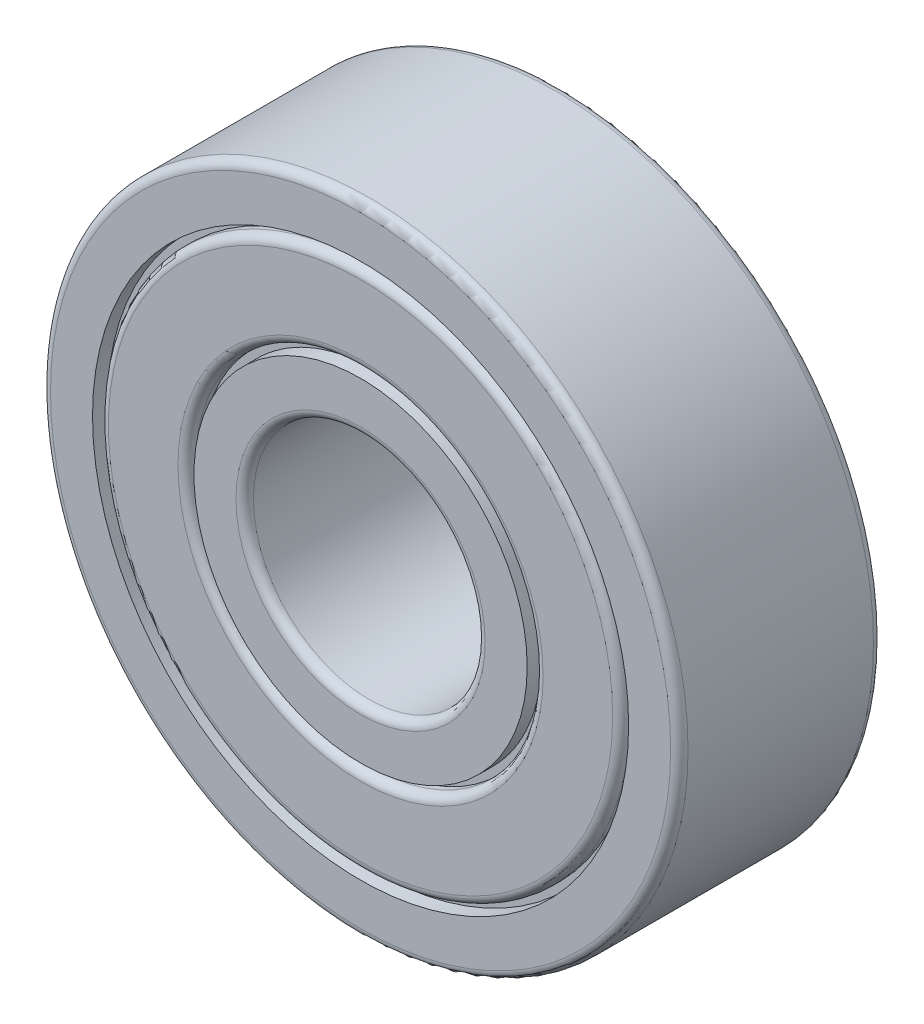
ISO-10303-21;
HEADER;
FILE_DESCRIPTION(('STEP AP214'),'2;1');
FILE_NAME('part.step','',(''),(''),'','','');
FILE_SCHEMA(('AUTOMOTIVE_DESIGN { 1 0 10303 214 1 1 1 1 }'));
ENDSEC;
DATA;
#1=APPLICATION_CONTEXT('core data for automotive mechanical design processes');
#2=APPLICATION_PROTOCOL_DEFINITION('international standard','automotive_design',2000,#1);
#3=PRODUCT_CONTEXT('',#1,'mechanical');
#4=PRODUCT('Part','Part','',(#3));
#5=PRODUCT_RELATED_PRODUCT_CATEGORY('part','',(#4));
#6=PRODUCT_DEFINITION_FORMATION('','',#4);
#7=PRODUCT_DEFINITION_CONTEXT('part definition',#1,'design');
#8=PRODUCT_DEFINITION('design','',#6,#7);
#9=PRODUCT_DEFINITION_SHAPE('','',#8);
#10=(LENGTH_UNIT() NAMED_UNIT(*) SI_UNIT(.MILLI.,.METRE.));
#11=(NAMED_UNIT(*) PLANE_ANGLE_UNIT() SI_UNIT($,.RADIAN.));
#12=(NAMED_UNIT(*) SI_UNIT($,.STERADIAN.) SOLID_ANGLE_UNIT());
#13=UNCERTAINTY_MEASURE_WITH_UNIT(LENGTH_MEASURE(1.E-05),#10,'distance_accuracy_value','');
#14=(GEOMETRIC_REPRESENTATION_CONTEXT(3) GLOBAL_UNCERTAINTY_ASSIGNED_CONTEXT((#13)) GLOBAL_UNIT_ASSIGNED_CONTEXT((#10,
#11,#12)) REPRESENTATION_CONTEXT('',''));
#15=CARTESIAN_POINT('',(0.,0.,0.));
#16=DIRECTION('',(0.,0.,1.));
#17=DIRECTION('',(1.,0.,0.));
#18=AXIS2_PLACEMENT_3D('',#15,#16,#17);
#19=CARTESIAN_POINT('',(0.,0.,-25.4558441227157));
#20=DIRECTION('',(0.,0.,1.));
#21=DIRECTION('',(1.,0.,0.));
#22=AXIS2_PLACEMENT_3D('',#19,#20,#21);
#23=CYLINDRICAL_SURFACE('',#22,6.);
#24=CARTESIAN_POINT('',(0.,0.,0.5));
#25=DIRECTION('',(0.,0.,-1.));
#26=DIRECTION('',(-1.,0.,0.));
#27=AXIS2_PLACEMENT_3D('',#24,#25,#26);
#28=CIRCLE('',#27,6.);
#29=CARTESIAN_POINT('',(-6.,0.,0.5));
#30=VERTEX_POINT('',#29);
#31=EDGE_CURVE('E90',#30,#30,#28,.T.);
#32=ORIENTED_EDGE('',*,*,#31,.F.);
#33=EDGE_LOOP('',(#32));
#34=FACE_BOUND('',#33,.T.);
#35=CARTESIAN_POINT('',(0.,0.,0.));
#36=DIRECTION('',(0.,0.,1.));
#37=DIRECTION('',(1.,0.,0.));
#38=AXIS2_PLACEMENT_3D('',#35,#36,#37);
#39=CIRCLE('',#38,6.);
#40=CARTESIAN_POINT('',(6.,0.,0.));
#41=VERTEX_POINT('',#40);
#42=EDGE_CURVE('E70',#41,#41,#39,.F.);
#43=ORIENTED_EDGE('',*,*,#42,.T.);
#44=EDGE_LOOP('',(#43));
#45=FACE_BOUND('',#44,.T.);
#46=ADVANCED_FACE('F43',(#34,#45),#23,.F.);
#47=CARTESIAN_POINT('',(0.,0.,-25.4558441227157));
#48=DIRECTION('',(0.,0.,1.));
#49=DIRECTION('',(1.,0.,0.));
#50=AXIS2_PLACEMENT_3D('',#47,#48,#49);
#51=CYLINDRICAL_SURFACE('',#50,9.);
#52=CARTESIAN_POINT('',(0.,0.,0.5));
#53=DIRECTION('',(0.,0.,-1.));
#54=DIRECTION('',(-1.,0.,0.));
#55=AXIS2_PLACEMENT_3D('',#52,#53,#54);
#56=CIRCLE('',#55,9.);
#57=CARTESIAN_POINT('',(-9.,0.,0.5));
#58=VERTEX_POINT('',#57);
#59=EDGE_CURVE('E11',#58,#58,#56,.F.);
#60=ORIENTED_EDGE('',*,*,#59,.F.);
#61=EDGE_LOOP('',(#60));
#62=FACE_BOUND('',#61,.T.);
#63=CARTESIAN_POINT('',(0.,0.,0.));
#64=DIRECTION('',(0.,0.,1.));
#65=DIRECTION('',(1.,0.,0.));
#66=AXIS2_PLACEMENT_3D('',#63,#64,#65);
#67=CIRCLE('',#66,9.);
#68=CARTESIAN_POINT('',(9.,0.,0.));
#69=VERTEX_POINT('',#68);
#70=EDGE_CURVE('E69',#69,#69,#67,.F.);
#71=ORIENTED_EDGE('',*,*,#70,.F.);
#72=EDGE_LOOP('',(#71));
#73=FACE_BOUND('',#72,.T.);
#74=ADVANCED_FACE('F99',(#62,#73),#51,.T.);
#75=CARTESIAN_POINT('',(0.,0.,6.5));
#76=DIRECTION('',(0.,0.,1.));
#77=DIRECTION('',(1.,0.,0.));
#78=AXIS2_PLACEMENT_3D('',#75,#76,#77);
#79=CIRCLE('',#78,9.);
#80=CARTESIAN_POINT('',(9.,0.,6.5));
#81=VERTEX_POINT('',#80);
#82=EDGE_CURVE('E50',#81,#81,#79,.F.);
#83=ORIENTED_EDGE('',*,*,#82,.F.);
#84=EDGE_LOOP('',(#83));
#85=FACE_BOUND('',#84,.T.);
#86=CARTESIAN_POINT('',(0.,0.,6.7));
#87=DIRECTION('',(0.,0.,1.));
#88=DIRECTION('',(1.,0.,0.));
#89=AXIS2_PLACEMENT_3D('',#86,#87,#88);
#90=CIRCLE('',#89,9.);
#91=CARTESIAN_POINT('',(9.,0.,6.7));
#92=VERTEX_POINT('',#91);
#93=EDGE_CURVE('E54',#92,#92,#90,.F.);
#94=ORIENTED_EDGE('',*,*,#93,.T.);
#95=EDGE_LOOP('',(#94));
#96=FACE_BOUND('',#95,.T.);
#97=ADVANCED_FACE('F122',(#85,#96),#51,.T.);
#98=CARTESIAN_POINT('',(0.,0.,7.));
#99=DIRECTION('',(0.,0.,1.));
#100=DIRECTION('',(1.,0.,0.));
#101=AXIS2_PLACEMENT_3D('',#98,#99,#100);
#102=PLANE('',#101);
#103=CARTESIAN_POINT('',(0.,0.,7.));
#104=DIRECTION('',(0.,0.,1.));
#105=DIRECTION('',(1.,0.,0.));
#106=AXIS2_PLACEMENT_3D('',#103,#104,#105);
#107=CIRCLE('',#106,6.3);
#108=CARTESIAN_POINT('',(6.3,0.,7.));
#109=VERTEX_POINT('',#108);
#110=EDGE_CURVE('E58',#109,#109,#107,.F.);
#111=ORIENTED_EDGE('',*,*,#110,.T.);
#112=EDGE_LOOP('',(#111));
#113=FACE_BOUND('',#112,.T.);
#114=CARTESIAN_POINT('',(0.,0.,7.));
#115=DIRECTION('',(0.,0.,1.));
#116=DIRECTION('',(1.,0.,0.));
#117=AXIS2_PLACEMENT_3D('',#114,#115,#116);
#118=CIRCLE('',#117,8.7);
#119=CARTESIAN_POINT('',(8.7,0.,7.));
#120=VERTEX_POINT('',#119);
#121=EDGE_CURVE('E63',#120,#120,#118,.T.);
#122=ORIENTED_EDGE('',*,*,#121,.T.);
#123=EDGE_LOOP('',(#122));
#124=FACE_BOUND('',#123,.T.);
#125=ADVANCED_FACE('F114',(#113,#124),#102,.T.);
#126=CARTESIAN_POINT('',(0.,0.,6.5));
#127=DIRECTION('',(0.,0.,-1.));
#128=DIRECTION('',(-1.,0.,0.));
#129=AXIS2_PLACEMENT_3D('',#126,#127,#128);
#130=CIRCLE('',#129,6.);
#131=CARTESIAN_POINT('',(-6.,0.,6.5));
#132=VERTEX_POINT('',#131);
#133=EDGE_CURVE('E87',#132,#132,#130,.T.);
#134=ORIENTED_EDGE('',*,*,#133,.T.);
#135=EDGE_LOOP('',(#134));
#136=FACE_BOUND('',#135,.T.);
#137=CARTESIAN_POINT('',(0.,0.,6.7));
#138=DIRECTION('',(0.,0.,1.));
#139=DIRECTION('',(1.,0.,0.));
#140=AXIS2_PLACEMENT_3D('',#137,#138,#139);
#141=CIRCLE('',#140,6.);
#142=CARTESIAN_POINT('',(6.,0.,6.7));
#143=VERTEX_POINT('',#142);
#144=EDGE_CURVE('E66',#143,#143,#141,.T.);
#145=ORIENTED_EDGE('',*,*,#144,.T.);
#146=EDGE_LOOP('',(#145));
#147=FACE_BOUND('',#146,.T.);
#148=ADVANCED_FACE('F101',(#136,#147),#23,.F.);
#149=CARTESIAN_POINT('',(0.,0.,0.));
#150=DIRECTION('',(0.,0.,1.));
#151=DIRECTION('',(1.,0.,0.));
#152=AXIS2_PLACEMENT_3D('',#149,#150,#151);
#153=PLANE('',#152);
#154=ORIENTED_EDGE('',*,*,#70,.T.);
#155=EDGE_LOOP('',(#154));
#156=FACE_BOUND('',#155,.T.);
#157=ORIENTED_EDGE('',*,*,#42,.F.);
#158=EDGE_LOOP('',(#157));
#159=FACE_BOUND('',#158,.T.);
#160=ADVANCED_FACE('F104',(#156,#159),#153,.F.);
#161=CARTESIAN_POINT('',(0.,0.,6.7));
#162=DIRECTION('',(0.,0.,1.));
#163=DIRECTION('',(1.,0.,0.));
#164=AXIS2_PLACEMENT_3D('',#161,#162,#163);
#165=TOROIDAL_SURFACE('',#164,6.3,0.3);
#166=ORIENTED_EDGE('',*,*,#110,.F.);
#167=EDGE_LOOP('',(#166));
#168=FACE_BOUND('',#167,.T.);
#169=ORIENTED_EDGE('',*,*,#144,.F.);
#170=EDGE_LOOP('',(#169));
#171=FACE_BOUND('',#170,.T.);
#172=ADVANCED_FACE('F106',(#168,#171),#165,.T.);
#173=CARTESIAN_POINT('',(0.,0.,6.7));
#174=DIRECTION('',(0.,0.,1.));
#175=DIRECTION('',(1.,0.,0.));
#176=AXIS2_PLACEMENT_3D('',#173,#174,#175);
#177=TOROIDAL_SURFACE('',#176,8.7,0.3);
#178=ORIENTED_EDGE('',*,*,#93,.F.);
#179=EDGE_LOOP('',(#178));
#180=FACE_BOUND('',#179,.T.);
#181=ORIENTED_EDGE('',*,*,#121,.F.);
#182=EDGE_LOOP('',(#181));
#183=FACE_BOUND('',#182,.T.);
#184=ADVANCED_FACE('F45',(#180,#183),#177,.T.);
#185=CARTESIAN_POINT('',(0.,9.25,0.5));
#186=DIRECTION('',(0.,0.,-1.));
#187=DIRECTION('',(-1.,0.,0.));
#188=AXIS2_PLACEMENT_3D('',#185,#186,#187);
#189=PLANE('',#188);
#190=CARTESIAN_POINT('',(0.,0.,0.5));
#191=DIRECTION('',(0.,0.,-1.));
#192=DIRECTION('',(-1.,0.,0.));
#193=AXIS2_PLACEMENT_3D('',#190,#191,#192);
#194=CIRCLE('',#193,9.25);
#195=CARTESIAN_POINT('',(-9.25,0.,0.5));
#196=VERTEX_POINT('',#195);
#197=EDGE_CURVE('E78',#196,#196,#194,.T.);
#198=ORIENTED_EDGE('',*,*,#197,.T.);
#199=EDGE_LOOP('',(#198));
#200=FACE_BOUND('',#199,.T.);
#201=ORIENTED_EDGE('',*,*,#59,.T.);
#202=EDGE_LOOP('',(#201));
#203=FACE_BOUND('',#202,.T.);
#204=ADVANCED_FACE('F117',(#200,#203),#189,.T.);
#205=CARTESIAN_POINT('',(0.,9.25,6.5));
#206=DIRECTION('',(0.,0.,1.));
#207=DIRECTION('',(1.,0.,0.));
#208=AXIS2_PLACEMENT_3D('',#205,#206,#207);
#209=PLANE('',#208);
#210=ORIENTED_EDGE('',*,*,#82,.T.);
#211=EDGE_LOOP('',(#210));
#212=FACE_BOUND('',#211,.T.);
#213=CARTESIAN_POINT('',(0.,0.,6.5));
#214=DIRECTION('',(0.,0.,-1.));
#215=DIRECTION('',(-1.,0.,0.));
#216=AXIS2_PLACEMENT_3D('',#213,#214,#215);
#217=CIRCLE('',#216,9.25);
#218=CARTESIAN_POINT('',(-9.25,0.,6.5));
#219=VERTEX_POINT('',#218);
#220=EDGE_CURVE('E73',#219,#219,#217,.T.);
#221=ORIENTED_EDGE('',*,*,#220,.F.);
#222=EDGE_LOOP('',(#221));
#223=FACE_BOUND('',#222,.T.);
#224=ADVANCED_FACE('F140',(#212,#223),#209,.T.);
#225=CARTESIAN_POINT('',(0.,0.,-0.35));
#226=DIRECTION('',(0.,0.,-1.));
#227=DIRECTION('',(-1.,0.,0.));
#228=AXIS2_PLACEMENT_3D('',#225,#226,#227);
#229=CYLINDRICAL_SURFACE('',#228,9.25);
#230=ORIENTED_EDGE('',*,*,#220,.T.);
#231=EDGE_LOOP('',(#230));
#232=FACE_BOUND('',#231,.T.);
#233=ORIENTED_EDGE('',*,*,#197,.F.);
#234=EDGE_LOOP('',(#233));
#235=FACE_BOUND('',#234,.T.);
#236=ADVANCED_FACE('F145',(#232,#235),#229,.T.);
#237=CARTESIAN_POINT('',(0.,6.,0.5));
#238=DIRECTION('',(0.,0.,-1.));
#239=DIRECTION('',(-1.,0.,0.));
#240=AXIS2_PLACEMENT_3D('',#237,#238,#239);
#241=PLANE('',#240);
#242=ORIENTED_EDGE('',*,*,#31,.T.);
#243=EDGE_LOOP('',(#242));
#244=FACE_BOUND('',#243,.T.);
#245=CARTESIAN_POINT('',(0.,0.,0.5));
#246=DIRECTION('',(0.,0.,-1.));
#247=DIRECTION('',(-1.,0.,0.));
#248=AXIS2_PLACEMENT_3D('',#245,#246,#247);
#249=CIRCLE('',#248,5.75);
#250=CARTESIAN_POINT('',(-5.75,0.,0.5));
#251=VERTEX_POINT('',#250);
#252=EDGE_CURVE('E81',#251,#251,#249,.T.);
#253=ORIENTED_EDGE('',*,*,#252,.F.);
#254=EDGE_LOOP('',(#253));
#255=FACE_BOUND('',#254,.T.);
#256=ADVANCED_FACE('F94',(#244,#255),#241,.T.);
#257=CARTESIAN_POINT('',(0.,0.,-0.35));
#258=DIRECTION('',(0.,0.,-1.));
#259=DIRECTION('',(-1.,0.,0.));
#260=AXIS2_PLACEMENT_3D('',#257,#258,#259);
#261=CYLINDRICAL_SURFACE('',#260,5.75);
#262=ORIENTED_EDGE('',*,*,#252,.T.);
#263=EDGE_LOOP('',(#262));
#264=FACE_BOUND('',#263,.T.);
#265=CARTESIAN_POINT('',(0.,0.,6.5));
#266=DIRECTION('',(0.,0.,-1.));
#267=DIRECTION('',(-1.,0.,0.));
#268=AXIS2_PLACEMENT_3D('',#265,#266,#267);
#269=CIRCLE('',#268,5.75);
#270=CARTESIAN_POINT('',(-5.75,0.,6.5));
#271=VERTEX_POINT('',#270);
#272=EDGE_CURVE('E84',#271,#271,#269,.T.);
#273=ORIENTED_EDGE('',*,*,#272,.F.);
#274=EDGE_LOOP('',(#273));
#275=FACE_BOUND('',#274,.T.);
#276=ADVANCED_FACE('F154',(#264,#275),#261,.F.);
#277=CARTESIAN_POINT('',(0.,6.,6.5));
#278=DIRECTION('',(0.,0.,1.));
#279=DIRECTION('',(1.,0.,0.));
#280=AXIS2_PLACEMENT_3D('',#277,#278,#279);
#281=PLANE('',#280);
#282=ORIENTED_EDGE('',*,*,#272,.T.);
#283=EDGE_LOOP('',(#282));
#284=FACE_BOUND('',#283,.T.);
#285=ORIENTED_EDGE('',*,*,#133,.F.);
#286=EDGE_LOOP('',(#285));
#287=FACE_BOUND('',#286,.T.);
#288=ADVANCED_FACE('F159',(#284,#287),#281,.T.);
#289=CLOSED_SHELL('',(#46,#74,#97,#125,#148,#160,#172,#184,#204,#224,#236,#256,#276,#288));
#290=MANIFOLD_SOLID_BREP('B2',#289);
#291=CARTESIAN_POINT('',(0.,0.,7.));
#292=DIRECTION('',(0.,0.,1.));
#293=DIRECTION('',(1.,0.,0.));
#294=AXIS2_PLACEMENT_3D('',#291,#292,#293);
#295=PLANE('',#294);
#296=CARTESIAN_POINT('',(0.,0.,7.));
#297=DIRECTION('',(0.,0.,1.));
#298=DIRECTION('',(1.,0.,0.));
#299=AXIS2_PLACEMENT_3D('',#296,#297,#298);
#300=CIRCLE('',#299,9.25);
#301=CARTESIAN_POINT('',(9.25,0.,7.));
#302=VERTEX_POINT('',#301);
#303=EDGE_CURVE('E42',#302,#302,#300,.T.);
#304=ORIENTED_EDGE('',*,*,#303,.F.);
#305=EDGE_LOOP('',(#304));
#306=FACE_BOUND('',#305,.T.);
#307=CARTESIAN_POINT('',(0.,0.,7.));
#308=DIRECTION('',(0.,0.,1.));
#309=DIRECTION('',(1.,0.,0.));
#310=AXIS2_PLACEMENT_3D('',#307,#308,#309);
#311=CIRCLE('',#310,10.7);
#312=CARTESIAN_POINT('',(10.7,0.,7.));
#313=VERTEX_POINT('',#312);
#314=EDGE_CURVE('E279',#313,#313,#311,.T.);
#315=ORIENTED_EDGE('',*,*,#314,.T.);
#316=EDGE_LOOP('',(#315));
#317=FACE_BOUND('',#316,.T.);
#318=ADVANCED_FACE('F259',(#306,#317),#295,.T.);
#319=CARTESIAN_POINT('',(0.,0.,0.));
#320=DIRECTION('',(0.,0.,1.));
#321=DIRECTION('',(1.,0.,0.));
#322=AXIS2_PLACEMENT_3D('',#319,#320,#321);
#323=PLANE('',#322);
#324=CARTESIAN_POINT('',(0.,0.,0.));
#325=DIRECTION('',(0.,0.,1.));
#326=DIRECTION('',(1.,0.,0.));
#327=AXIS2_PLACEMENT_3D('',#324,#325,#326);
#328=CIRCLE('',#327,9.25);
#329=CARTESIAN_POINT('',(9.25,0.,0.));
#330=VERTEX_POINT('',#329);
#331=EDGE_CURVE('E263',#330,#330,#328,.T.);
#332=ORIENTED_EDGE('',*,*,#331,.T.);
#333=EDGE_LOOP('',(#332));
#334=FACE_BOUND('',#333,.T.);
#335=CARTESIAN_POINT('',(0.,0.,0.));
#336=DIRECTION('',(0.,0.,1.));
#337=DIRECTION('',(1.,0.,0.));
#338=AXIS2_PLACEMENT_3D('',#335,#336,#337);
#339=CIRCLE('',#338,10.7);
#340=CARTESIAN_POINT('',(10.7,0.,0.));
#341=VERTEX_POINT('',#340);
#342=EDGE_CURVE('E274',#341,#341,#339,.F.);
#343=ORIENTED_EDGE('',*,*,#342,.T.);
#344=EDGE_LOOP('',(#343));
#345=FACE_BOUND('',#344,.T.);
#346=ADVANCED_FACE('F261',(#334,#345),#323,.F.);
#347=CARTESIAN_POINT('',(0.,0.,7.));
#348=DIRECTION('',(0.,0.,-1.));
#349=DIRECTION('',(-1.,0.,0.));
#350=AXIS2_PLACEMENT_3D('',#347,#348,#349);
#351=CYLINDRICAL_SURFACE('',#350,11.);
#352=CARTESIAN_POINT('',(0.,0.,0.3));
#353=DIRECTION('',(0.,0.,1.));
#354=DIRECTION('',(1.,0.,0.));
#355=AXIS2_PLACEMENT_3D('',#352,#353,#354);
#356=CIRCLE('',#355,11.);
#357=CARTESIAN_POINT('',(11.,0.,0.3));
#358=VERTEX_POINT('',#357);
#359=EDGE_CURVE('E271',#358,#358,#356,.T.);
#360=ORIENTED_EDGE('',*,*,#359,.T.);
#361=EDGE_LOOP('',(#360));
#362=FACE_BOUND('',#361,.T.);
#363=CARTESIAN_POINT('',(0.,0.,6.7));
#364=DIRECTION('',(0.,0.,1.));
#365=DIRECTION('',(1.,0.,0.));
#366=AXIS2_PLACEMENT_3D('',#363,#364,#365);
#367=CIRCLE('',#366,11.);
#368=CARTESIAN_POINT('',(11.,0.,6.7));
#369=VERTEX_POINT('',#368);
#370=EDGE_CURVE('E267',#369,#369,#367,.F.);
#371=ORIENTED_EDGE('',*,*,#370,.T.);
#372=EDGE_LOOP('',(#371));
#373=FACE_BOUND('',#372,.T.);
#374=ADVANCED_FACE('F304',(#362,#373),#351,.T.);
#375=CARTESIAN_POINT('',(0.,0.,0.3));
#376=DIRECTION('',(0.,0.,1.));
#377=DIRECTION('',(1.,0.,0.));
#378=AXIS2_PLACEMENT_3D('',#375,#376,#377);
#379=TOROIDAL_SURFACE('',#378,10.7,0.3);
#380=ORIENTED_EDGE('',*,*,#342,.F.);
#381=EDGE_LOOP('',(#380));
#382=FACE_BOUND('',#381,.T.);
#383=ORIENTED_EDGE('',*,*,#359,.F.);
#384=EDGE_LOOP('',(#383));
#385=FACE_BOUND('',#384,.T.);
#386=ADVANCED_FACE('F295',(#382,#385),#379,.T.);
#387=CARTESIAN_POINT('',(0.,0.,6.7));
#388=DIRECTION('',(0.,0.,1.));
#389=DIRECTION('',(1.,0.,0.));
#390=AXIS2_PLACEMENT_3D('',#387,#388,#389);
#391=TOROIDAL_SURFACE('',#390,10.7,0.3);
#392=ORIENTED_EDGE('',*,*,#370,.F.);
#393=EDGE_LOOP('',(#392));
#394=FACE_BOUND('',#393,.T.);
#395=ORIENTED_EDGE('',*,*,#314,.F.);
#396=EDGE_LOOP('',(#395));
#397=FACE_BOUND('',#396,.T.);
#398=ADVANCED_FACE('F290',(#394,#397),#391,.T.);
#399=CARTESIAN_POINT('',(0.,0.,0.));
#400=DIRECTION('',(0.,0.,1.));
#401=DIRECTION('',(1.,0.,0.));
#402=AXIS2_PLACEMENT_3D('',#399,#400,#401);
#403=CYLINDRICAL_SURFACE('',#402,9.25);
#404=ORIENTED_EDGE('',*,*,#331,.F.);
#405=EDGE_LOOP('',(#404));
#406=FACE_BOUND('',#405,.T.);
#407=ORIENTED_EDGE('',*,*,#303,.T.);
#408=EDGE_LOOP('',(#407));
#409=FACE_BOUND('',#408,.T.);
#410=ADVANCED_FACE('F288',(#406,#409),#403,.F.);
#411=CLOSED_SHELL('',(#318,#346,#374,#386,#398,#410));
#412=MANIFOLD_SOLID_BREP('B6',#411);
#413=CARTESIAN_POINT('',(0.,0.,6.7));
#414=DIRECTION('',(0.,0.,1.));
#415=DIRECTION('',(1.,0.,0.));
#416=AXIS2_PLACEMENT_3D('',#413,#414,#415);
#417=TOROIDAL_SURFACE('',#416,4.3,0.3);
#418=CARTESIAN_POINT('',(0.,0.,7.));
#419=DIRECTION('',(0.,0.,1.));
#420=DIRECTION('',(1.,0.,0.));
#421=AXIS2_PLACEMENT_3D('',#418,#419,#420);
#422=CIRCLE('',#421,4.3);
#423=CARTESIAN_POINT('',(4.3,0.,7.));
#424=VERTEX_POINT('',#423);
#425=EDGE_CURVE('E258',#424,#424,#422,.F.);
#426=ORIENTED_EDGE('',*,*,#425,.F.);
#427=EDGE_LOOP('',(#426));
#428=FACE_BOUND('',#427,.T.);
#429=CARTESIAN_POINT('',(0.,0.,6.7));
#430=DIRECTION('',(0.,0.,1.));
#431=DIRECTION('',(1.,0.,0.));
#432=AXIS2_PLACEMENT_3D('',#429,#430,#431);
#433=CIRCLE('',#432,4.);
#434=CARTESIAN_POINT('',(4.,0.,6.7));
#435=VERTEX_POINT('',#434);
#436=EDGE_CURVE('E360',#435,#435,#433,.T.);
#437=ORIENTED_EDGE('',*,*,#436,.F.);
#438=EDGE_LOOP('',(#437));
#439=FACE_BOUND('',#438,.T.);
#440=ADVANCED_FACE('F350',(#428,#439),#417,.T.);
#441=CARTESIAN_POINT('',(0.,0.,7.));
#442=DIRECTION('',(0.,0.,1.));
#443=DIRECTION('',(1.,0.,0.));
#444=AXIS2_PLACEMENT_3D('',#441,#442,#443);
#445=PLANE('',#444);
#446=ORIENTED_EDGE('',*,*,#425,.T.);
#447=EDGE_LOOP('',(#446));
#448=FACE_BOUND('',#447,.T.);
#449=CARTESIAN_POINT('',(0.,0.,7.));
#450=DIRECTION('',(0.,0.,1.));
#451=DIRECTION('',(1.,0.,0.));
#452=AXIS2_PLACEMENT_3D('',#449,#450,#451);
#453=CIRCLE('',#452,5.75);
#454=CARTESIAN_POINT('',(5.75,0.,7.));
#455=VERTEX_POINT('',#454);
#456=EDGE_CURVE('E370',#455,#455,#453,.T.);
#457=ORIENTED_EDGE('',*,*,#456,.T.);
#458=EDGE_LOOP('',(#457));
#459=FACE_BOUND('',#458,.T.);
#460=ADVANCED_FACE('F393',(#448,#459),#445,.T.);
#461=CARTESIAN_POINT('',(0.,0.,7.));
#462=DIRECTION('',(0.,0.,-1.));
#463=DIRECTION('',(-1.,0.,0.));
#464=AXIS2_PLACEMENT_3D('',#461,#462,#463);
#465=CYLINDRICAL_SURFACE('',#464,4.);
#466=CARTESIAN_POINT('',(0.,0.,0.3));
#467=DIRECTION('',(0.,0.,1.));
#468=DIRECTION('',(1.,0.,0.));
#469=AXIS2_PLACEMENT_3D('',#466,#467,#468);
#470=CIRCLE('',#469,4.);
#471=CARTESIAN_POINT('',(4.,0.,0.3));
#472=VERTEX_POINT('',#471);
#473=EDGE_CURVE('E356',#472,#472,#470,.F.);
#474=ORIENTED_EDGE('',*,*,#473,.T.);
#475=EDGE_LOOP('',(#474));
#476=FACE_BOUND('',#475,.T.);
#477=ORIENTED_EDGE('',*,*,#436,.T.);
#478=EDGE_LOOP('',(#477));
#479=FACE_BOUND('',#478,.T.);
#480=ADVANCED_FACE('F389',(#476,#479),#465,.F.);
#481=CARTESIAN_POINT('',(0.,0.,0.3));
#482=DIRECTION('',(0.,0.,1.));
#483=DIRECTION('',(1.,0.,0.));
#484=AXIS2_PLACEMENT_3D('',#481,#482,#483);
#485=TOROIDAL_SURFACE('',#484,4.3,0.3);
#486=ORIENTED_EDGE('',*,*,#473,.F.);
#487=EDGE_LOOP('',(#486));
#488=FACE_BOUND('',#487,.T.);
#489=CARTESIAN_POINT('',(0.,0.,0.));
#490=DIRECTION('',(0.,0.,1.));
#491=DIRECTION('',(1.,0.,0.));
#492=AXIS2_PLACEMENT_3D('',#489,#490,#491);
#493=CIRCLE('',#492,4.3);
#494=CARTESIAN_POINT('',(4.3,0.,0.));
#495=VERTEX_POINT('',#494);
#496=EDGE_CURVE('E364',#495,#495,#493,.T.);
#497=ORIENTED_EDGE('',*,*,#496,.F.);
#498=EDGE_LOOP('',(#497));
#499=FACE_BOUND('',#498,.T.);
#500=ADVANCED_FACE('F381',(#488,#499),#485,.T.);
#501=CARTESIAN_POINT('',(0.,0.,0.));
#502=DIRECTION('',(0.,0.,1.));
#503=DIRECTION('',(1.,0.,0.));
#504=AXIS2_PLACEMENT_3D('',#501,#502,#503);
#505=PLANE('',#504);
#506=ORIENTED_EDGE('',*,*,#496,.T.);
#507=EDGE_LOOP('',(#506));
#508=FACE_BOUND('',#507,.T.);
#509=CARTESIAN_POINT('',(0.,0.,0.));
#510=DIRECTION('',(0.,0.,1.));
#511=DIRECTION('',(1.,0.,0.));
#512=AXIS2_PLACEMENT_3D('',#509,#510,#511);
#513=CIRCLE('',#512,5.75);
#514=CARTESIAN_POINT('',(5.75,0.,0.));
#515=VERTEX_POINT('',#514);
#516=EDGE_CURVE('E369',#515,#515,#513,.T.);
#517=ORIENTED_EDGE('',*,*,#516,.F.);
#518=EDGE_LOOP('',(#517));
#519=FACE_BOUND('',#518,.T.);
#520=ADVANCED_FACE('F379',(#508,#519),#505,.F.);
#521=CARTESIAN_POINT('',(0.,0.,0.));
#522=DIRECTION('',(0.,0.,1.));
#523=DIRECTION('',(1.,0.,0.));
#524=AXIS2_PLACEMENT_3D('',#521,#522,#523);
#525=CYLINDRICAL_SURFACE('',#524,5.75);
#526=ORIENTED_EDGE('',*,*,#516,.T.);
#527=EDGE_LOOP('',(#526));
#528=FACE_BOUND('',#527,.T.);
#529=ORIENTED_EDGE('',*,*,#456,.F.);
#530=EDGE_LOOP('',(#529));
#531=FACE_BOUND('',#530,.T.);
#532=ADVANCED_FACE('F376',(#528,#531),#525,.T.);
#533=CLOSED_SHELL('',(#440,#460,#480,#500,#520,#532));
#534=MANIFOLD_SOLID_BREP('B37',#533);
#535=ADVANCED_BREP_SHAPE_REPRESENTATION('',(#18,#290,#412,#534),#14);
#536=SHAPE_DEFINITION_REPRESENTATION(#9,#535);
ENDSEC;
END-ISO-10303-21;
